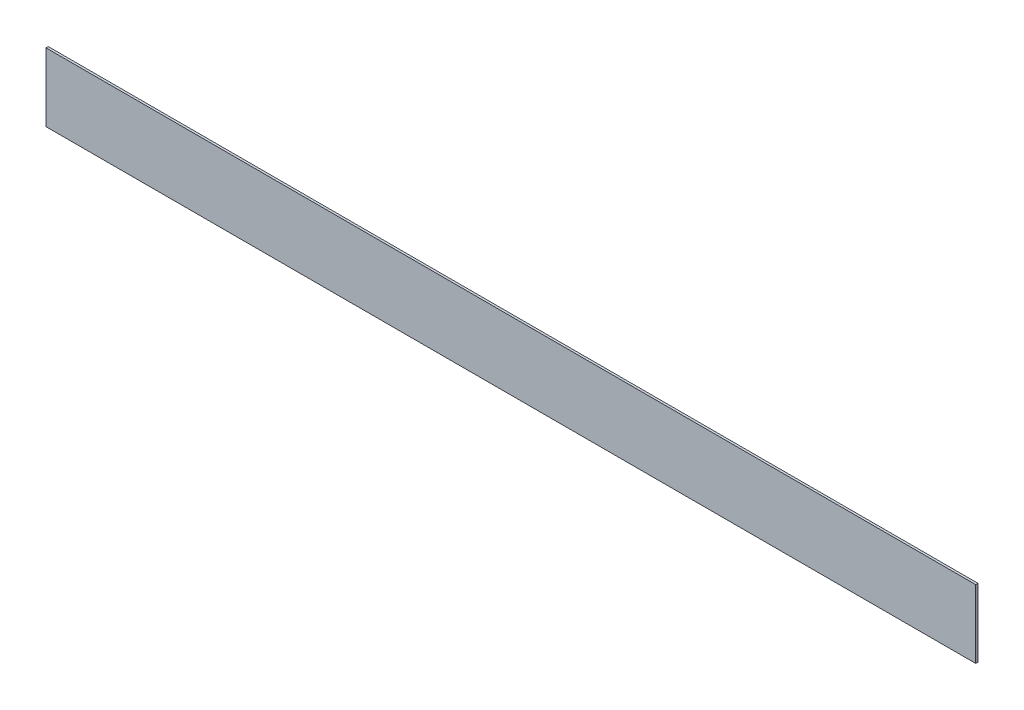
ISO-10303-21;
HEADER;
FILE_DESCRIPTION(('STEP AP214'),'2;1');
FILE_NAME('part.step','',(''),(''),'','','');
FILE_SCHEMA(('AUTOMOTIVE_DESIGN { 1 0 10303 214 1 1 1 1 }'));
ENDSEC;
DATA;
#1=APPLICATION_CONTEXT('core data for automotive mechanical design processes');
#2=APPLICATION_PROTOCOL_DEFINITION('international standard','automotive_design',2000,#1);
#3=PRODUCT_CONTEXT('',#1,'mechanical');
#4=PRODUCT('Part','Part','',(#3));
#5=PRODUCT_RELATED_PRODUCT_CATEGORY('part','',(#4));
#6=PRODUCT_DEFINITION_FORMATION('','',#4);
#7=PRODUCT_DEFINITION_CONTEXT('part definition',#1,'design');
#8=PRODUCT_DEFINITION('design','',#6,#7);
#9=PRODUCT_DEFINITION_SHAPE('','',#8);
#10=(LENGTH_UNIT() NAMED_UNIT(*) SI_UNIT(.MILLI.,.METRE.));
#11=(NAMED_UNIT(*) PLANE_ANGLE_UNIT() SI_UNIT($,.RADIAN.));
#12=(NAMED_UNIT(*) SI_UNIT($,.STERADIAN.) SOLID_ANGLE_UNIT());
#13=UNCERTAINTY_MEASURE_WITH_UNIT(LENGTH_MEASURE(1.E-05),#10,'distance_accuracy_value','');
#14=(GEOMETRIC_REPRESENTATION_CONTEXT(3) GLOBAL_UNCERTAINTY_ASSIGNED_CONTEXT((#13)) GLOBAL_UNIT_ASSIGNED_CONTEXT((#10,
#11,#12)) REPRESENTATION_CONTEXT('',''));
#15=CARTESIAN_POINT('',(0.,0.,0.));
#16=DIRECTION('',(0.,0.,1.));
#17=DIRECTION('',(1.,0.,0.));
#18=AXIS2_PLACEMENT_3D('',#15,#16,#17);
#19=CARTESIAN_POINT('',(0.,0.,5.));
#20=DIRECTION('',(1.,0.,0.));
#21=DIRECTION('',(0.,0.,-1.));
#22=AXIS2_PLACEMENT_3D('',#19,#20,#21);
#23=PLANE('',#22);
#24=DIRECTION('',(0.,-1.,0.));
#25=VECTOR('',#24,1.);
#26=CARTESIAN_POINT('',(0.,0.,0.));
#27=LINE('',#26,#25);
#28=CARTESIAN_POINT('',(0.,151.,0.));
#29=VERTEX_POINT('',#28);
#30=CARTESIAN_POINT('',(0.,0.,0.));
#31=VERTEX_POINT('',#30);
#32=EDGE_CURVE('E97',#29,#31,#27,.T.);
#33=ORIENTED_EDGE('',*,*,#32,.T.);
#34=DIRECTION('',(0.,0.,-1.));
#35=VECTOR('',#34,1.);
#36=CARTESIAN_POINT('',(0.,0.,5.));
#37=LINE('',#36,#35);
#38=CARTESIAN_POINT('',(0.,0.,5.));
#39=VERTEX_POINT('',#38);
#40=EDGE_CURVE('E11',#39,#31,#37,.T.);
#41=ORIENTED_EDGE('',*,*,#40,.F.);
#42=DIRECTION('',(0.,-1.,0.));
#43=VECTOR('',#42,1.);
#44=CARTESIAN_POINT('',(0.,0.,5.));
#45=LINE('',#44,#43);
#46=CARTESIAN_POINT('',(0.,151.,5.));
#47=VERTEX_POINT('',#46);
#48=EDGE_CURVE('E85',#47,#39,#45,.T.);
#49=ORIENTED_EDGE('',*,*,#48,.F.);
#50=DIRECTION('',(0.,0.,-1.));
#51=VECTOR('',#50,1.);
#52=CARTESIAN_POINT('',(0.,151.,5.));
#53=LINE('',#52,#51);
#54=EDGE_CURVE('E93',#47,#29,#53,.T.);
#55=ORIENTED_EDGE('',*,*,#54,.T.);
#56=EDGE_LOOP('',(#33,#41,#49,#55));
#57=FACE_BOUND('',#56,.T.);
#58=ADVANCED_FACE('F34',(#57),#23,.F.);
#59=CARTESIAN_POINT('',(0.,0.,5.));
#60=DIRECTION('',(0.,1.,0.));
#61=DIRECTION('',(0.,0.,1.));
#62=AXIS2_PLACEMENT_3D('',#59,#60,#61);
#63=PLANE('',#62);
#64=DIRECTION('',(1.,0.,0.));
#65=VECTOR('',#64,1.);
#66=CARTESIAN_POINT('',(0.,0.,0.));
#67=LINE('',#66,#65);
#68=CARTESIAN_POINT('',(2056.,0.,0.));
#69=VERTEX_POINT('',#68);
#70=EDGE_CURVE('E89',#31,#69,#67,.T.);
#71=ORIENTED_EDGE('',*,*,#70,.T.);
#72=DIRECTION('',(0.,0.,-1.));
#73=VECTOR('',#72,1.);
#74=CARTESIAN_POINT('',(2056.,0.,5.));
#75=LINE('',#74,#73);
#76=CARTESIAN_POINT('',(2056.,0.,5.));
#77=VERTEX_POINT('',#76);
#78=EDGE_CURVE('E42',#77,#69,#75,.T.);
#79=ORIENTED_EDGE('',*,*,#78,.F.);
#80=DIRECTION('',(1.,0.,0.));
#81=VECTOR('',#80,1.);
#82=CARTESIAN_POINT('',(0.,0.,5.));
#83=LINE('',#82,#81);
#84=EDGE_CURVE('E80',#39,#77,#83,.T.);
#85=ORIENTED_EDGE('',*,*,#84,.F.);
#86=ORIENTED_EDGE('',*,*,#40,.T.);
#87=EDGE_LOOP('',(#71,#79,#85,#86));
#88=FACE_BOUND('',#87,.T.);
#89=ADVANCED_FACE('F88',(#88),#63,.F.);
#90=CARTESIAN_POINT('',(2056.,0.,5.));
#91=DIRECTION('',(-1.,0.,0.));
#92=DIRECTION('',(0.,0.,1.));
#93=AXIS2_PLACEMENT_3D('',#90,#91,#92);
#94=PLANE('',#93);
#95=DIRECTION('',(0.,1.,0.));
#96=VECTOR('',#95,1.);
#97=CARTESIAN_POINT('',(2056.,0.,0.));
#98=LINE('',#97,#96);
#99=CARTESIAN_POINT('',(2056.,151.,0.));
#100=VERTEX_POINT('',#99);
#101=EDGE_CURVE('E67',#69,#100,#98,.T.);
#102=ORIENTED_EDGE('',*,*,#101,.T.);
#103=DIRECTION('',(0.,0.,-1.));
#104=VECTOR('',#103,1.);
#105=CARTESIAN_POINT('',(2056.,151.,5.));
#106=LINE('',#105,#104);
#107=CARTESIAN_POINT('',(2056.,151.,5.));
#108=VERTEX_POINT('',#107);
#109=EDGE_CURVE('E90',#108,#100,#106,.T.);
#110=ORIENTED_EDGE('',*,*,#109,.F.);
#111=DIRECTION('',(0.,1.,0.));
#112=VECTOR('',#111,1.);
#113=CARTESIAN_POINT('',(2056.,0.,5.));
#114=LINE('',#113,#112);
#115=EDGE_CURVE('E83',#77,#108,#114,.T.);
#116=ORIENTED_EDGE('',*,*,#115,.F.);
#117=ORIENTED_EDGE('',*,*,#78,.T.);
#118=EDGE_LOOP('',(#102,#110,#116,#117));
#119=FACE_BOUND('',#118,.T.);
#120=ADVANCED_FACE('F91',(#119),#94,.F.);
#121=CARTESIAN_POINT('',(0.,151.,5.));
#122=DIRECTION('',(0.,-1.,0.));
#123=DIRECTION('',(0.,0.,-1.));
#124=AXIS2_PLACEMENT_3D('',#121,#122,#123);
#125=PLANE('',#124);
#126=DIRECTION('',(-1.,0.,0.));
#127=VECTOR('',#126,1.);
#128=CARTESIAN_POINT('',(0.,151.,0.));
#129=LINE('',#128,#127);
#130=EDGE_CURVE('E73',#100,#29,#129,.T.);
#131=ORIENTED_EDGE('',*,*,#130,.T.);
#132=ORIENTED_EDGE('',*,*,#54,.F.);
#133=DIRECTION('',(-1.,0.,0.));
#134=VECTOR('',#133,1.);
#135=CARTESIAN_POINT('',(0.,151.,5.));
#136=LINE('',#135,#134);
#137=EDGE_CURVE('E50',#108,#47,#136,.T.);
#138=ORIENTED_EDGE('',*,*,#137,.F.);
#139=ORIENTED_EDGE('',*,*,#109,.T.);
#140=EDGE_LOOP('',(#131,#132,#138,#139));
#141=FACE_BOUND('',#140,.T.);
#142=ADVANCED_FACE('F104',(#141),#125,.F.);
#143=CARTESIAN_POINT('',(0.,0.,5.));
#144=DIRECTION('',(0.,0.,-1.));
#145=DIRECTION('',(-1.,0.,0.));
#146=AXIS2_PLACEMENT_3D('',#143,#144,#145);
#147=PLANE('',#146);
#148=ORIENTED_EDGE('',*,*,#48,.T.);
#149=ORIENTED_EDGE('',*,*,#84,.T.);
#150=ORIENTED_EDGE('',*,*,#115,.T.);
#151=ORIENTED_EDGE('',*,*,#137,.T.);
#152=EDGE_LOOP('',(#148,#149,#150,#151));
#153=FACE_BOUND('',#152,.T.);
#154=ADVANCED_FACE('F81',(#153),#147,.F.);
#155=CARTESIAN_POINT('',(0.,0.,0.));
#156=DIRECTION('',(0.,0.,-1.));
#157=DIRECTION('',(-1.,0.,0.));
#158=AXIS2_PLACEMENT_3D('',#155,#156,#157);
#159=PLANE('',#158);
#160=ORIENTED_EDGE('',*,*,#32,.F.);
#161=ORIENTED_EDGE('',*,*,#130,.F.);
#162=ORIENTED_EDGE('',*,*,#101,.F.);
#163=ORIENTED_EDGE('',*,*,#70,.F.);
#164=EDGE_LOOP('',(#160,#161,#162,#163));
#165=FACE_BOUND('',#164,.T.);
#166=ADVANCED_FACE('F107',(#165),#159,.T.);
#167=CLOSED_SHELL('',(#58,#89,#120,#142,#154,#166));
#168=MANIFOLD_SOLID_BREP('B2',#167);
#169=ADVANCED_BREP_SHAPE_REPRESENTATION('',(#18,#168),#14);
#170=SHAPE_DEFINITION_REPRESENTATION(#9,#169);
ENDSEC;
END-ISO-10303-21;
